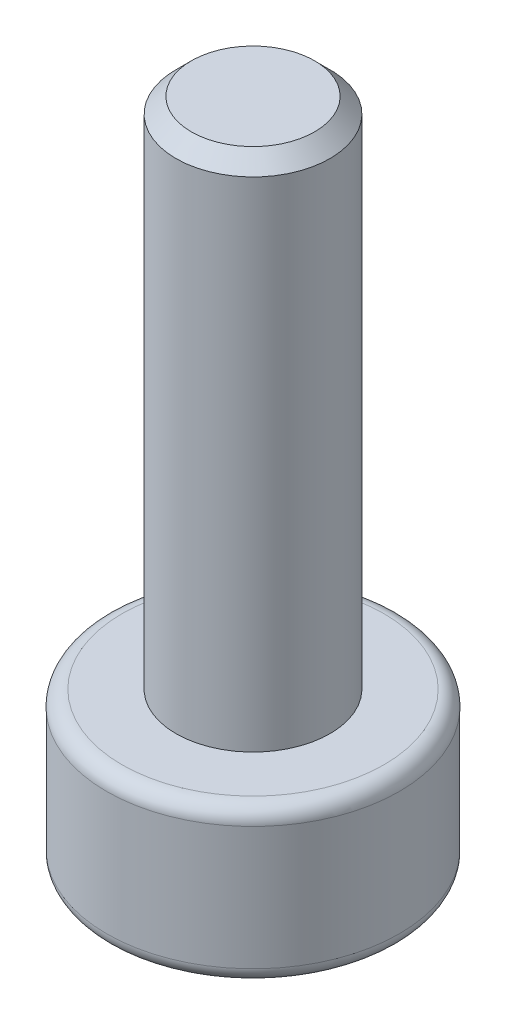
ISO-10303-21;
HEADER;
FILE_DESCRIPTION(('STEP AP214'),'2;1');
FILE_NAME('part.step','',(''),(''),'','','');
FILE_SCHEMA(('AUTOMOTIVE_DESIGN { 1 0 10303 214 1 1 1 1 }'));
ENDSEC;
DATA;
#1=APPLICATION_CONTEXT('core data for automotive mechanical design processes');
#2=APPLICATION_PROTOCOL_DEFINITION('international standard','automotive_design',2000,#1);
#3=PRODUCT_CONTEXT('',#1,'mechanical');
#4=PRODUCT('Part','Part','',(#3));
#5=PRODUCT_RELATED_PRODUCT_CATEGORY('part','',(#4));
#6=PRODUCT_DEFINITION_FORMATION('','',#4);
#7=PRODUCT_DEFINITION_CONTEXT('part definition',#1,'design');
#8=PRODUCT_DEFINITION('design','',#6,#7);
#9=PRODUCT_DEFINITION_SHAPE('','',#8);
#10=(LENGTH_UNIT() NAMED_UNIT(*) SI_UNIT(.MILLI.,.METRE.));
#11=(NAMED_UNIT(*) PLANE_ANGLE_UNIT() SI_UNIT($,.RADIAN.));
#12=(NAMED_UNIT(*) SI_UNIT($,.STERADIAN.) SOLID_ANGLE_UNIT());
#13=UNCERTAINTY_MEASURE_WITH_UNIT(LENGTH_MEASURE(1.E-05),#10,'distance_accuracy_value','');
#14=(GEOMETRIC_REPRESENTATION_CONTEXT(3) GLOBAL_UNCERTAINTY_ASSIGNED_CONTEXT((#13)) GLOBAL_UNIT_ASSIGNED_CONTEXT((#10,
#11,#12)) REPRESENTATION_CONTEXT('',''));
#15=CARTESIAN_POINT('',(0.,0.,0.));
#16=DIRECTION('',(0.,0.,1.));
#17=DIRECTION('',(1.,0.,0.));
#18=AXIS2_PLACEMENT_3D('',#15,#16,#17);
#19=CARTESIAN_POINT('',(0.,3.,0.));
#20=DIRECTION('',(0.,-1.,0.));
#21=DIRECTION('',(0.,0.,-1.));
#22=AXIS2_PLACEMENT_3D('',#19,#20,#21);
#23=CYLINDRICAL_SURFACE('',#22,2.85);
#24=CARTESIAN_POINT('',(0.,2.7,0.));
#25=DIRECTION('',(0.,1.,0.));
#26=DIRECTION('',(0.,0.,1.));
#27=AXIS2_PLACEMENT_3D('',#24,#25,#26);
#28=CIRCLE('',#27,2.85);
#29=CARTESIAN_POINT('',(0.,2.7,2.85));
#30=VERTEX_POINT('',#29);
#31=EDGE_CURVE('E68',#30,#30,#28,.F.);
#32=ORIENTED_EDGE('',*,*,#31,.T.);
#33=EDGE_LOOP('',(#32));
#34=FACE_BOUND('',#33,.T.);
#35=CARTESIAN_POINT('',(0.,0.3,0.));
#36=DIRECTION('',(0.,1.,0.));
#37=DIRECTION('',(0.,0.,1.));
#38=AXIS2_PLACEMENT_3D('',#35,#36,#37);
#39=CIRCLE('',#38,2.85);
#40=CARTESIAN_POINT('',(0.,0.3,2.85));
#41=VERTEX_POINT('',#40);
#42=EDGE_CURVE('E72',#41,#41,#39,.T.);
#43=ORIENTED_EDGE('',*,*,#42,.T.);
#44=EDGE_LOOP('',(#43));
#45=FACE_BOUND('',#44,.T.);
#46=ADVANCED_FACE('F39',(#34,#45),#23,.T.);
#47=CARTESIAN_POINT('',(0.,3.,0.));
#48=DIRECTION('',(0.,1.,0.));
#49=DIRECTION('',(0.,0.,1.));
#50=AXIS2_PLACEMENT_3D('',#47,#48,#49);
#51=PLANE('',#50);
#52=CARTESIAN_POINT('',(0.,3.,0.));
#53=DIRECTION('',(0.,1.,0.));
#54=DIRECTION('',(0.,0.,1.));
#55=AXIS2_PLACEMENT_3D('',#52,#53,#54);
#56=CIRCLE('',#55,2.55);
#57=CARTESIAN_POINT('',(0.,3.,2.55));
#58=VERTEX_POINT('',#57);
#59=EDGE_CURVE('E76',#58,#58,#56,.T.);
#60=ORIENTED_EDGE('',*,*,#59,.T.);
#61=EDGE_LOOP('',(#60));
#62=FACE_BOUND('',#61,.T.);
#63=CARTESIAN_POINT('',(0.,3.,0.));
#64=DIRECTION('',(0.,1.,0.));
#65=DIRECTION('',(0.,0.,1.));
#66=AXIS2_PLACEMENT_3D('',#63,#64,#65);
#67=CIRCLE('',#66,1.5);
#68=CARTESIAN_POINT('',(0.,3.,1.5));
#69=VERTEX_POINT('',#68);
#70=EDGE_CURVE('E80',#69,#69,#67,.T.);
#71=ORIENTED_EDGE('',*,*,#70,.F.);
#72=EDGE_LOOP('',(#71));
#73=FACE_BOUND('',#72,.T.);
#74=ADVANCED_FACE('F105',(#62,#73),#51,.T.);
#75=CARTESIAN_POINT('',(0.,0.,0.));
#76=DIRECTION('',(0.,1.,0.));
#77=DIRECTION('',(0.,0.,1.));
#78=AXIS2_PLACEMENT_3D('',#75,#76,#77);
#79=PLANE('',#78);
#80=CARTESIAN_POINT('',(0.,0.,0.));
#81=DIRECTION('',(0.,1.,0.));
#82=DIRECTION('',(0.,0.,1.));
#83=AXIS2_PLACEMENT_3D('',#80,#81,#82);
#84=CIRCLE('',#83,1.44);
#85=CARTESIAN_POINT('',(0.,0.,1.44));
#86=VERTEX_POINT('',#85);
#87=EDGE_CURVE('E10',#86,#86,#84,.T.);
#88=ORIENTED_EDGE('',*,*,#87,.T.);
#89=EDGE_LOOP('',(#88));
#90=FACE_BOUND('',#89,.T.);
#91=CARTESIAN_POINT('',(0.,0.,0.));
#92=DIRECTION('',(0.,1.,0.));
#93=DIRECTION('',(0.,0.,1.));
#94=AXIS2_PLACEMENT_3D('',#91,#92,#93);
#95=CIRCLE('',#94,2.55);
#96=CARTESIAN_POINT('',(0.,0.,2.55));
#97=VERTEX_POINT('',#96);
#98=EDGE_CURVE('E64',#97,#97,#95,.F.);
#99=ORIENTED_EDGE('',*,*,#98,.T.);
#100=EDGE_LOOP('',(#99));
#101=FACE_BOUND('',#100,.T.);
#102=ADVANCED_FACE('F111',(#90,#101),#79,.F.);
#103=CARTESIAN_POINT('',(0.,13.,0.));
#104=DIRECTION('',(0.,-1.,0.));
#105=DIRECTION('',(0.,0.,-1.));
#106=AXIS2_PLACEMENT_3D('',#103,#104,#105);
#107=CYLINDRICAL_SURFACE('',#106,1.5);
#108=CARTESIAN_POINT('',(0.,12.7,0.));
#109=DIRECTION('',(0.,1.,0.));
#110=DIRECTION('',(0.,0.,1.));
#111=AXIS2_PLACEMENT_3D('',#108,#109,#110);
#112=CIRCLE('',#111,1.5);
#113=CARTESIAN_POINT('',(0.,12.7,1.5));
#114=VERTEX_POINT('',#113);
#115=EDGE_CURVE('E53',#114,#114,#112,.F.);
#116=ORIENTED_EDGE('',*,*,#115,.T.);
#117=EDGE_LOOP('',(#116));
#118=FACE_BOUND('',#117,.T.);
#119=ORIENTED_EDGE('',*,*,#70,.T.);
#120=EDGE_LOOP('',(#119));
#121=FACE_BOUND('',#120,.T.);
#122=ADVANCED_FACE('F101',(#118,#121),#107,.T.);
#123=CARTESIAN_POINT('',(0.,13.,0.));
#124=DIRECTION('',(0.,1.,0.));
#125=DIRECTION('',(0.,0.,1.));
#126=AXIS2_PLACEMENT_3D('',#123,#124,#125);
#127=PLANE('',#126);
#128=CARTESIAN_POINT('',(0.,13.,0.));
#129=DIRECTION('',(0.,1.,0.));
#130=DIRECTION('',(0.,0.,1.));
#131=AXIS2_PLACEMENT_3D('',#128,#129,#130);
#132=CIRCLE('',#131,1.2);
#133=CARTESIAN_POINT('',(0.,13.,1.2));
#134=VERTEX_POINT('',#133);
#135=EDGE_CURVE('E58',#134,#134,#132,.T.);
#136=ORIENTED_EDGE('',*,*,#135,.T.);
#137=EDGE_LOOP('',(#136));
#138=FACE_BOUND('',#137,.T.);
#139=ADVANCED_FACE('F93',(#138),#127,.T.);
#140=CARTESIAN_POINT('',(0.,1.3,0.));
#141=DIRECTION('',(0.,-1.,0.));
#142=DIRECTION('',(0.,0.,-1.));
#143=AXIS2_PLACEMENT_3D('',#140,#141,#142);
#144=CYLINDRICAL_SURFACE('',#143,1.29);
#145=CARTESIAN_POINT('',(0.,0.150000000000001,0.));
#146=DIRECTION('',(0.,1.,0.));
#147=DIRECTION('',(0.,0.,1.));
#148=AXIS2_PLACEMENT_3D('',#145,#146,#147);
#149=CIRCLE('',#148,1.29);
#150=CARTESIAN_POINT('',(0.,0.150000000000001,1.29));
#151=VERTEX_POINT('',#150);
#152=EDGE_CURVE('E48',#151,#151,#149,.F.);
#153=ORIENTED_EDGE('',*,*,#152,.T.);
#154=EDGE_LOOP('',(#153));
#155=FACE_BOUND('',#154,.T.);
#156=CARTESIAN_POINT('',(0.,1.3,0.));
#157=DIRECTION('',(0.,-1.,0.));
#158=DIRECTION('',(0.,0.,-1.));
#159=AXIS2_PLACEMENT_3D('',#156,#157,#158);
#160=CIRCLE('',#159,1.29);
#161=CARTESIAN_POINT('',(0.,1.3,-1.29));
#162=VERTEX_POINT('',#161);
#163=EDGE_CURVE('E84',#162,#162,#160,.T.);
#164=ORIENTED_EDGE('',*,*,#163,.F.);
#165=EDGE_LOOP('',(#164));
#166=FACE_BOUND('',#165,.T.);
#167=ADVANCED_FACE('F91',(#155,#166),#144,.F.);
#168=CARTESIAN_POINT('',(0.,1.3,0.));
#169=DIRECTION('',(0.,-1.,0.));
#170=DIRECTION('',(0.,0.,-1.));
#171=AXIS2_PLACEMENT_3D('',#168,#169,#170);
#172=PLANE('',#171);
#173=ORIENTED_EDGE('',*,*,#163,.T.);
#174=EDGE_LOOP('',(#173));
#175=FACE_BOUND('',#174,.T.);
#176=ADVANCED_FACE('F89',(#175),#172,.T.);
#177=CARTESIAN_POINT('',(0.,2.7,0.));
#178=DIRECTION('',(0.,1.,0.));
#179=DIRECTION('',(0.,0.,1.));
#180=AXIS2_PLACEMENT_3D('',#177,#178,#179);
#181=TOROIDAL_SURFACE('',#180,2.55,0.3);
#182=ORIENTED_EDGE('',*,*,#31,.F.);
#183=EDGE_LOOP('',(#182));
#184=FACE_BOUND('',#183,.T.);
#185=ORIENTED_EDGE('',*,*,#59,.F.);
#186=EDGE_LOOP('',(#185));
#187=FACE_BOUND('',#186,.T.);
#188=ADVANCED_FACE('F99',(#184,#187),#181,.T.);
#189=CARTESIAN_POINT('',(0.,0.3,0.));
#190=DIRECTION('',(0.,1.,0.));
#191=DIRECTION('',(0.,0.,1.));
#192=AXIS2_PLACEMENT_3D('',#189,#190,#191);
#193=TOROIDAL_SURFACE('',#192,2.55,0.3);
#194=ORIENTED_EDGE('',*,*,#98,.F.);
#195=EDGE_LOOP('',(#194));
#196=FACE_BOUND('',#195,.T.);
#197=ORIENTED_EDGE('',*,*,#42,.F.);
#198=EDGE_LOOP('',(#197));
#199=FACE_BOUND('',#198,.T.);
#200=ADVANCED_FACE('F119',(#196,#199),#193,.T.);
#201=CARTESIAN_POINT('',(0.,13.,0.));
#202=DIRECTION('',(0.,-1.,0.));
#203=DIRECTION('',(0.,0.,-1.));
#204=AXIS2_PLACEMENT_3D('',#201,#202,#203);
#205=CONICAL_SURFACE('',#204,1.2,0.785398163397444);
#206=ORIENTED_EDGE('',*,*,#115,.F.);
#207=EDGE_LOOP('',(#206));
#208=FACE_BOUND('',#207,.T.);
#209=ORIENTED_EDGE('',*,*,#135,.F.);
#210=EDGE_LOOP('',(#209));
#211=FACE_BOUND('',#210,.T.);
#212=ADVANCED_FACE('F122',(#208,#211),#205,.T.);
#213=CARTESIAN_POINT('',(0.,0.150000000000001,0.));
#214=DIRECTION('',(0.,-1.,0.));
#215=DIRECTION('',(0.,0.,-1.));
#216=AXIS2_PLACEMENT_3D('',#213,#214,#215);
#217=CONICAL_SURFACE('',#216,1.29,0.78539816339745);
#218=ORIENTED_EDGE('',*,*,#87,.F.);
#219=EDGE_LOOP('',(#218));
#220=FACE_BOUND('',#219,.T.);
#221=ORIENTED_EDGE('',*,*,#152,.F.);
#222=EDGE_LOOP('',(#221));
#223=FACE_BOUND('',#222,.T.);
#224=ADVANCED_FACE('F42',(#220,#223),#217,.F.);
#225=CLOSED_SHELL('',(#46,#74,#102,#122,#139,#167,#176,#188,#200,#212,#224));
#226=MANIFOLD_SOLID_BREP('B2',#225);
#227=ADVANCED_BREP_SHAPE_REPRESENTATION('',(#18,#226),#14);
#228=SHAPE_DEFINITION_REPRESENTATION(#9,#227);
ENDSEC;
END-ISO-10303-21;
